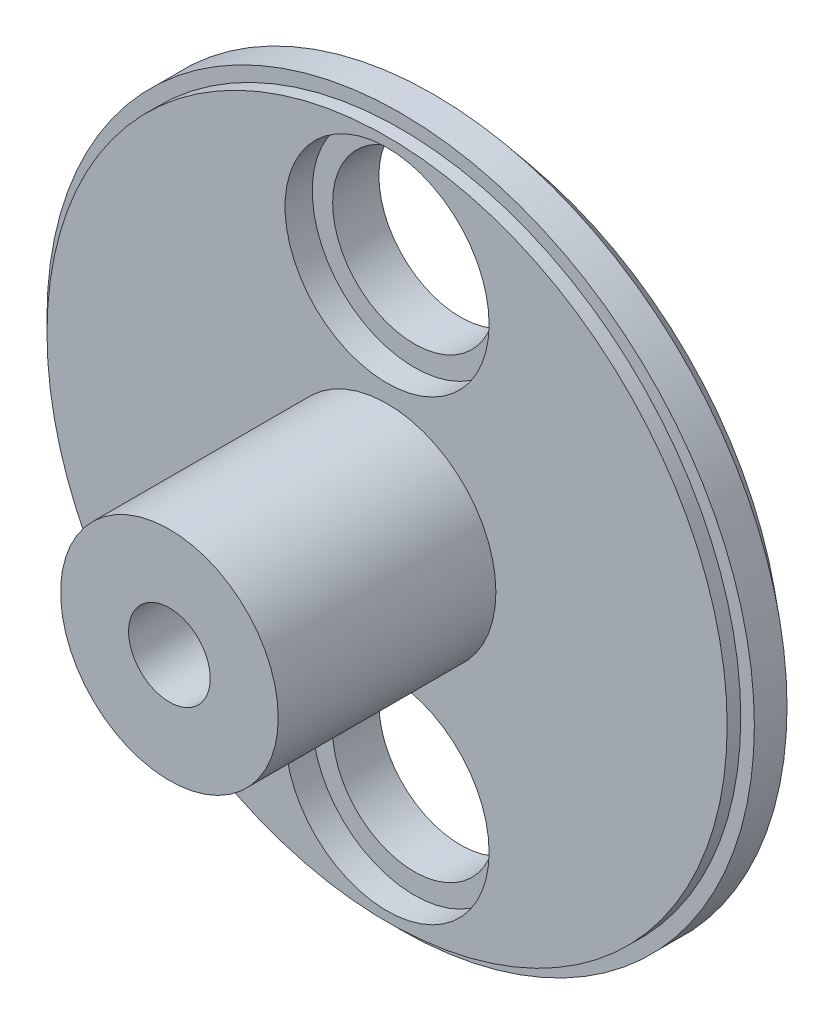
ISO-10303-21;
HEADER;
FILE_DESCRIPTION(('STEP AP214'),'2;1');
FILE_NAME('part.step','',(''),(''),'','','');
FILE_SCHEMA(('AUTOMOTIVE_DESIGN { 1 0 10303 214 1 1 1 1 }'));
ENDSEC;
DATA;
#1=APPLICATION_CONTEXT('core data for automotive mechanical design processes');
#2=APPLICATION_PROTOCOL_DEFINITION('international standard','automotive_design',2000,#1);
#3=PRODUCT_CONTEXT('',#1,'mechanical');
#4=PRODUCT('Part','Part','',(#3));
#5=PRODUCT_RELATED_PRODUCT_CATEGORY('part','',(#4));
#6=PRODUCT_DEFINITION_FORMATION('','',#4);
#7=PRODUCT_DEFINITION_CONTEXT('part definition',#1,'design');
#8=PRODUCT_DEFINITION('design','',#6,#7);
#9=PRODUCT_DEFINITION_SHAPE('','',#8);
#10=(LENGTH_UNIT() NAMED_UNIT(*) SI_UNIT(.MILLI.,.METRE.));
#11=(NAMED_UNIT(*) PLANE_ANGLE_UNIT() SI_UNIT($,.RADIAN.));
#12=(NAMED_UNIT(*) SI_UNIT($,.STERADIAN.) SOLID_ANGLE_UNIT());
#13=UNCERTAINTY_MEASURE_WITH_UNIT(LENGTH_MEASURE(1.E-05),#10,'distance_accuracy_value','');
#14=(GEOMETRIC_REPRESENTATION_CONTEXT(3) GLOBAL_UNCERTAINTY_ASSIGNED_CONTEXT((#13)) GLOBAL_UNIT_ASSIGNED_CONTEXT((#10,
#11,#12)) REPRESENTATION_CONTEXT('',''));
#15=CARTESIAN_POINT('',(0.,0.,0.));
#16=DIRECTION('',(0.,0.,1.));
#17=DIRECTION('',(1.,0.,0.));
#18=AXIS2_PLACEMENT_3D('',#15,#16,#17);
#19=CARTESIAN_POINT('',(0.,0.,2.7));
#20=DIRECTION('',(0.,0.,-1.));
#21=DIRECTION('',(-1.,0.,0.));
#22=AXIS2_PLACEMENT_3D('',#19,#20,#21);
#23=CYLINDRICAL_SURFACE('',#22,13.);
#24=CARTESIAN_POINT('',(0.,0.,0.999999999999999));
#25=DIRECTION('',(0.,0.,1.));
#26=DIRECTION('',(1.,0.,0.));
#27=AXIS2_PLACEMENT_3D('',#24,#25,#26);
#28=CIRCLE('',#27,13.);
#29=CARTESIAN_POINT('',(-13.,0.,0.999999999999999));
#30=VERTEX_POINT('',#29);
#31=EDGE_CURVE('E54',#30,#30,#28,.T.);
#32=CARTESIAN_POINT('',(0.,0.,2.2));
#33=DIRECTION('',(0.,0.,1.));
#34=DIRECTION('',(1.,0.,0.));
#35=AXIS2_PLACEMENT_3D('',#32,#33,#34);
#36=CIRCLE('',#35,13.);
#37=CARTESIAN_POINT('',(-13.,0.,2.2));
#38=VERTEX_POINT('',#37);
#39=EDGE_CURVE('E50',#38,#38,#36,.T.);
#40=CARTESIAN_POINT('',(-13.,0.,0.999999999999999));
#41=CARTESIAN_POINT('',(-13.,0.,1.0125));
#42=CARTESIAN_POINT('',(-13.,0.,1.025));
#43=CARTESIAN_POINT('',(-13.,0.,1.05));
#44=CARTESIAN_POINT('',(-13.,0.,1.0625));
#45=CARTESIAN_POINT('',(-13.,0.,1.0875));
#46=CARTESIAN_POINT('',(-13.,0.,1.1));
#47=CARTESIAN_POINT('',(-13.,0.,1.125));
#48=CARTESIAN_POINT('',(-13.,0.,1.1375));
#49=CARTESIAN_POINT('',(-13.,0.,1.1625));
#50=CARTESIAN_POINT('',(-13.,0.,1.175));
#51=CARTESIAN_POINT('',(-13.,0.,1.2));
#52=CARTESIAN_POINT('',(-13.,0.,1.2125));
#53=CARTESIAN_POINT('',(-13.,0.,1.2375));
#54=CARTESIAN_POINT('',(-13.,0.,1.25));
#55=CARTESIAN_POINT('',(-13.,0.,1.275));
#56=CARTESIAN_POINT('',(-13.,0.,1.2875));
#57=CARTESIAN_POINT('',(-13.,0.,1.3125));
#58=CARTESIAN_POINT('',(-13.,0.,1.325));
#59=CARTESIAN_POINT('',(-13.,0.,1.35));
#60=CARTESIAN_POINT('',(-13.,0.,1.3625));
#61=CARTESIAN_POINT('',(-13.,0.,1.3875));
#62=CARTESIAN_POINT('',(-13.,0.,1.4));
#63=CARTESIAN_POINT('',(-13.,0.,1.425));
#64=CARTESIAN_POINT('',(-13.,0.,1.4375));
#65=CARTESIAN_POINT('',(-13.,0.,1.4625));
#66=CARTESIAN_POINT('',(-13.,0.,1.475));
#67=CARTESIAN_POINT('',(-13.,0.,1.5));
#68=CARTESIAN_POINT('',(-13.,0.,1.5125));
#69=CARTESIAN_POINT('',(-13.,0.,1.5375));
#70=CARTESIAN_POINT('',(-13.,0.,1.55));
#71=CARTESIAN_POINT('',(-13.,0.,1.575));
#72=CARTESIAN_POINT('',(-13.,0.,1.5875));
#73=CARTESIAN_POINT('',(-13.,0.,1.6125));
#74=CARTESIAN_POINT('',(-13.,0.,1.625));
#75=CARTESIAN_POINT('',(-13.,0.,1.65));
#76=CARTESIAN_POINT('',(-13.,0.,1.6625));
#77=CARTESIAN_POINT('',(-13.,0.,1.6875));
#78=CARTESIAN_POINT('',(-13.,0.,1.7));
#79=CARTESIAN_POINT('',(-13.,0.,1.725));
#80=CARTESIAN_POINT('',(-13.,0.,1.7375));
#81=CARTESIAN_POINT('',(-13.,0.,1.7625));
#82=CARTESIAN_POINT('',(-13.,0.,1.775));
#83=CARTESIAN_POINT('',(-13.,0.,1.8));
#84=CARTESIAN_POINT('',(-13.,0.,1.8125));
#85=CARTESIAN_POINT('',(-13.,0.,1.8375));
#86=CARTESIAN_POINT('',(-13.,0.,1.85));
#87=CARTESIAN_POINT('',(-13.,0.,1.875));
#88=CARTESIAN_POINT('',(-13.,0.,1.8875));
#89=CARTESIAN_POINT('',(-13.,0.,1.9125));
#90=CARTESIAN_POINT('',(-13.,0.,1.925));
#91=CARTESIAN_POINT('',(-13.,0.,1.95));
#92=CARTESIAN_POINT('',(-13.,0.,1.9625));
#93=CARTESIAN_POINT('',(-13.,0.,1.9875));
#94=CARTESIAN_POINT('',(-13.,0.,2.));
#95=CARTESIAN_POINT('',(-13.,0.,2.025));
#96=CARTESIAN_POINT('',(-13.,0.,2.0375));
#97=CARTESIAN_POINT('',(-13.,0.,2.0625));
#98=CARTESIAN_POINT('',(-13.,0.,2.075));
#99=CARTESIAN_POINT('',(-13.,0.,2.1));
#100=CARTESIAN_POINT('',(-13.,0.,2.1125));
#101=CARTESIAN_POINT('',(-13.,0.,2.1375));
#102=CARTESIAN_POINT('',(-13.,0.,2.15));
#103=CARTESIAN_POINT('',(-13.,0.,2.175));
#104=CARTESIAN_POINT('',(-13.,0.,2.1875));
#105=CARTESIAN_POINT('',(-13.,0.,2.2));
#106=B_SPLINE_CURVE_WITH_KNOTS('',3,(#40,#41,#42,#43,#44,#45,#46,#47,#48,#49,#50,#51,#52,#53,
#54,#55,#56,#57,#58,#59,#60,#61,#62,#63,#64,#65,#66,#67,#68,#69,#70,#71,#72,#73,#74,#75,#76,#77,
#78,#79,#80,#81,#82,#83,#84,#85,#86,#87,#88,#89,#90,#91,#92,#93,#94,#95,#96,#97,#98,#99,#100,
#101,#102,#103,#104,#105),.UNSPECIFIED.,.F.,.F.,(4,2,2,2,2,2,2,2,2,2,2,2,2,2,2,2,2,2,2,2,2,2,2,
2,2,2,2,2,2,2,2,2,4),(0.,0.0375,0.075,0.1125,0.15,0.1875,0.225,0.2625,0.3,0.3375,0.375,
0.412500000000001,0.45,0.487500000000001,0.525,0.5625,0.600000000000001,0.637500000000001,
0.675000000000001,0.712500000000001,0.750000000000001,0.787500000000001,0.825000000000001,
0.862500000000001,0.900000000000001,0.937500000000001,0.975000000000001,1.0125,1.05,1.0875,
1.125,1.1625,1.2),.UNSPECIFIED.);
#107=EDGE_CURVE('BSEAM45',#30,#38,#106,.T.);
#108=ORIENTED_EDGE('',*,*,#31,.T.);
#109=ORIENTED_EDGE('',*,*,#39,.F.);
#110=ORIENTED_EDGE('',*,*,#107,.T.);
#111=ORIENTED_EDGE('',*,*,#107,.F.);
#112=EDGE_LOOP('',(#108,#110,#109,#111));
#113=FACE_BOUND('',#112,.T.);
#114=ADVANCED_FACE('F45',(#113),#23,.T.);
#115=CARTESIAN_POINT('',(0.,0.,2.7));
#116=DIRECTION('',(0.,0.,1.));
#117=DIRECTION('',(1.,0.,0.));
#118=AXIS2_PLACEMENT_3D('',#115,#116,#117);
#119=PLANE('',#118);
#120=CARTESIAN_POINT('',(0.,0.,2.7));
#121=DIRECTION('',(0.,0.,1.));
#122=DIRECTION('',(1.,0.,0.));
#123=AXIS2_PLACEMENT_3D('',#120,#121,#122);
#124=CIRCLE('',#123,4.);
#125=CARTESIAN_POINT('',(4.,0.,2.7));
#126=VERTEX_POINT('',#125);
#127=EDGE_CURVE('E91',#126,#126,#124,.T.);
#128=ORIENTED_EDGE('',*,*,#127,.F.);
#129=EDGE_LOOP('',(#128));
#130=FACE_BOUND('',#129,.T.);
#131=CARTESIAN_POINT('',(0.,-8.4,2.7));
#132=DIRECTION('',(0.,0.,1.));
#133=DIRECTION('',(1.,0.,0.));
#134=AXIS2_PLACEMENT_3D('',#131,#132,#133);
#135=CIRCLE('',#134,3.75);
#136=CARTESIAN_POINT('',(3.75,-8.4,2.7));
#137=VERTEX_POINT('',#136);
#138=EDGE_CURVE('E67',#137,#137,#135,.T.);
#139=ORIENTED_EDGE('',*,*,#138,.F.);
#140=EDGE_LOOP('',(#139));
#141=FACE_BOUND('',#140,.T.);
#142=CARTESIAN_POINT('',(0.,8.4,2.7));
#143=DIRECTION('',(0.,0.,1.));
#144=DIRECTION('',(1.,0.,0.));
#145=AXIS2_PLACEMENT_3D('',#142,#143,#144);
#146=CIRCLE('',#145,3.75);
#147=CARTESIAN_POINT('',(3.75,8.4,2.7));
#148=VERTEX_POINT('',#147);
#149=EDGE_CURVE('E74',#148,#148,#146,.T.);
#150=ORIENTED_EDGE('',*,*,#149,.F.);
#151=EDGE_LOOP('',(#150));
#152=FACE_BOUND('',#151,.T.);
#153=CARTESIAN_POINT('',(0.,0.,2.7));
#154=DIRECTION('',(0.,0.,1.));
#155=DIRECTION('',(1.,0.,0.));
#156=AXIS2_PLACEMENT_3D('',#153,#154,#155);
#157=CIRCLE('',#156,12.5);
#158=CARTESIAN_POINT('',(12.5,0.,2.7));
#159=VERTEX_POINT('',#158);
#160=EDGE_CURVE('E84',#159,#159,#157,.T.);
#161=ORIENTED_EDGE('',*,*,#160,.T.);
#162=EDGE_LOOP('',(#161));
#163=FACE_BOUND('',#162,.T.);
#164=ADVANCED_FACE('F124',(#130,#141,#152,#163),#119,.T.);
#165=CARTESIAN_POINT('',(0.,8.4,2.7));
#166=DIRECTION('',(0.,0.,-1.));
#167=DIRECTION('',(-1.,0.,0.));
#168=AXIS2_PLACEMENT_3D('',#165,#166,#167);
#169=CYLINDRICAL_SURFACE('',#168,3.);
#170=CARTESIAN_POINT('',(0.,8.4,0.));
#171=DIRECTION('',(0.,0.,1.));
#172=DIRECTION('',(1.,0.,0.));
#173=AXIS2_PLACEMENT_3D('',#170,#171,#172);
#174=CIRCLE('',#173,3.);
#175=CARTESIAN_POINT('',(-3.,8.4,0.));
#176=VERTEX_POINT('',#175);
#177=EDGE_CURVE('E58',#176,#176,#174,.T.);
#178=CARTESIAN_POINT('',(0.,8.4,1.7));
#179=DIRECTION('',(0.,0.,1.));
#180=DIRECTION('',(1.,0.,0.));
#181=AXIS2_PLACEMENT_3D('',#178,#179,#180);
#182=CIRCLE('',#181,3.);
#183=CARTESIAN_POINT('',(-3.,8.4,1.7));
#184=VERTEX_POINT('',#183);
#185=EDGE_CURVE('E79',#184,#184,#182,.F.);
#186=CARTESIAN_POINT('',(-3.,8.4,0.));
#187=CARTESIAN_POINT('',(-3.,8.4,0.017708333333333));
#188=CARTESIAN_POINT('',(-3.,8.4,0.0354166666666664));
#189=CARTESIAN_POINT('',(-3.,8.4,0.070833333333333));
#190=CARTESIAN_POINT('',(-3.,8.4,0.0885416666666663));
#191=CARTESIAN_POINT('',(-3.,8.4,0.123958333333333));
#192=CARTESIAN_POINT('',(-3.,8.4,0.141666666666666));
#193=CARTESIAN_POINT('',(-3.,8.4,0.177083333333333));
#194=CARTESIAN_POINT('',(-3.,8.4,0.194791666666666));
#195=CARTESIAN_POINT('',(-3.,8.4,0.230208333333333));
#196=CARTESIAN_POINT('',(-3.,8.4,0.247916666666666));
#197=CARTESIAN_POINT('',(-3.,8.4,0.283333333333333));
#198=CARTESIAN_POINT('',(-3.,8.4,0.301041666666666));
#199=CARTESIAN_POINT('',(-3.,8.4,0.336458333333333));
#200=CARTESIAN_POINT('',(-3.,8.4,0.354166666666666));
#201=CARTESIAN_POINT('',(-3.,8.4,0.389583333333333));
#202=CARTESIAN_POINT('',(-3.,8.4,0.407291666666666));
#203=CARTESIAN_POINT('',(-3.,8.4,0.442708333333333));
#204=CARTESIAN_POINT('',(-3.,8.4,0.460416666666666));
#205=CARTESIAN_POINT('',(-3.,8.4,0.495833333333333));
#206=CARTESIAN_POINT('',(-3.,8.4,0.513541666666666));
#207=CARTESIAN_POINT('',(-3.,8.4,0.548958333333333));
#208=CARTESIAN_POINT('',(-3.,8.4,0.566666666666666));
#209=CARTESIAN_POINT('',(-3.,8.4,0.602083333333333));
#210=CARTESIAN_POINT('',(-3.,8.4,0.619791666666666));
#211=CARTESIAN_POINT('',(-3.,8.4,0.655208333333333));
#212=CARTESIAN_POINT('',(-3.,8.4,0.672916666666666));
#213=CARTESIAN_POINT('',(-3.,8.4,0.708333333333333));
#214=CARTESIAN_POINT('',(-3.,8.4,0.726041666666667));
#215=CARTESIAN_POINT('',(-3.,8.4,0.761458333333333));
#216=CARTESIAN_POINT('',(-3.,8.4,0.779166666666666));
#217=CARTESIAN_POINT('',(-3.,8.4,0.814583333333333));
#218=CARTESIAN_POINT('',(-3.,8.4,0.832291666666666));
#219=CARTESIAN_POINT('',(-3.,8.4,0.867708333333333));
#220=CARTESIAN_POINT('',(-3.,8.4,0.885416666666666));
#221=CARTESIAN_POINT('',(-3.,8.4,0.920833333333333));
#222=CARTESIAN_POINT('',(-3.,8.4,0.938541666666666));
#223=CARTESIAN_POINT('',(-3.,8.4,0.973958333333333));
#224=CARTESIAN_POINT('',(-3.,8.4,0.991666666666666));
#225=CARTESIAN_POINT('',(-3.,8.4,1.02708333333333));
#226=CARTESIAN_POINT('',(-3.,8.4,1.04479166666667));
#227=CARTESIAN_POINT('',(-3.,8.4,1.08020833333333));
#228=CARTESIAN_POINT('',(-3.,8.4,1.09791666666667));
#229=CARTESIAN_POINT('',(-3.,8.4,1.13333333333333));
#230=CARTESIAN_POINT('',(-3.,8.4,1.15104166666667));
#231=CARTESIAN_POINT('',(-3.,8.4,1.18645833333333));
#232=CARTESIAN_POINT('',(-3.,8.4,1.20416666666667));
#233=CARTESIAN_POINT('',(-3.,8.4,1.23958333333333));
#234=CARTESIAN_POINT('',(-3.,8.4,1.25729166666667));
#235=CARTESIAN_POINT('',(-3.,8.4,1.29270833333333));
#236=CARTESIAN_POINT('',(-3.,8.4,1.31041666666667));
#237=CARTESIAN_POINT('',(-3.,8.4,1.34583333333333));
#238=CARTESIAN_POINT('',(-3.,8.4,1.36354166666667));
#239=CARTESIAN_POINT('',(-3.,8.4,1.39895833333333));
#240=CARTESIAN_POINT('',(-3.,8.4,1.41666666666667));
#241=CARTESIAN_POINT('',(-3.,8.4,1.45208333333333));
#242=CARTESIAN_POINT('',(-3.,8.4,1.46979166666667));
#243=CARTESIAN_POINT('',(-3.,8.4,1.50520833333333));
#244=CARTESIAN_POINT('',(-3.,8.4,1.52291666666667));
#245=CARTESIAN_POINT('',(-3.,8.4,1.55833333333333));
#246=CARTESIAN_POINT('',(-3.,8.4,1.57604166666667));
#247=CARTESIAN_POINT('',(-3.,8.4,1.61145833333333));
#248=CARTESIAN_POINT('',(-3.,8.4,1.62916666666667));
#249=CARTESIAN_POINT('',(-3.,8.4,1.66458333333333));
#250=CARTESIAN_POINT('',(-3.,8.4,1.68229166666667));
#251=CARTESIAN_POINT('',(-3.,8.4,1.7));
#252=B_SPLINE_CURVE_WITH_KNOTS('',3,(#186,#187,#188,#189,#190,#191,#192,#193,#194,#195,#196,
#197,#198,#199,#200,#201,#202,#203,#204,#205,#206,#207,#208,#209,#210,#211,#212,#213,#214,#215,
#216,#217,#218,#219,#220,#221,#222,#223,#224,#225,#226,#227,#228,#229,#230,#231,#232,#233,#234,
#235,#236,#237,#238,#239,#240,#241,#242,#243,#244,#245,#246,#247,#248,#249,#250,#251),
.UNSPECIFIED.,.F.,.F.,(4,2,2,2,2,2,2,2,2,2,2,2,2,2,2,2,2,2,2,2,2,2,2,2,2,2,2,2,2,2,2,2,4),(0.,
0.0531250000000002,0.10625,0.159375,0.2125,0.265625,0.31875,0.371875,0.425,0.478125,0.53125,
0.584375,0.6375,0.690625,0.74375,0.796875,0.85,0.903125,0.95625,1.009375,1.0625,1.115625,
1.16875,1.221875,1.275,1.328125,1.38125,1.434375,1.4875,1.540625,1.59375,1.646875,1.7),.UNSPECIFIED.);
#253=EDGE_CURVE('BSEAM127',#176,#184,#252,.T.);
#254=ORIENTED_EDGE('',*,*,#177,.F.);
#255=ORIENTED_EDGE('',*,*,#185,.F.);
#256=ORIENTED_EDGE('',*,*,#253,.T.);
#257=ORIENTED_EDGE('',*,*,#253,.F.);
#258=EDGE_LOOP('',(#254,#256,#255,#257));
#259=FACE_BOUND('',#258,.T.);
#260=ADVANCED_FACE('F127',(#259),#169,.F.);
#261=CARTESIAN_POINT('',(0.,-8.4,2.7));
#262=DIRECTION('',(0.,0.,-1.));
#263=DIRECTION('',(-1.,0.,0.));
#264=AXIS2_PLACEMENT_3D('',#261,#262,#263);
#265=CYLINDRICAL_SURFACE('',#264,3.);
#266=CARTESIAN_POINT('',(0.,-8.4,0.));
#267=DIRECTION('',(0.,0.,1.));
#268=DIRECTION('',(1.,0.,0.));
#269=AXIS2_PLACEMENT_3D('',#266,#267,#268);
#270=CIRCLE('',#269,3.);
#271=CARTESIAN_POINT('',(-3.,-8.4,0.));
#272=VERTEX_POINT('',#271);
#273=EDGE_CURVE('E63',#272,#272,#270,.T.);
#274=CARTESIAN_POINT('',(0.,-8.4,1.7));
#275=DIRECTION('',(0.,0.,1.));
#276=DIRECTION('',(1.,0.,0.));
#277=AXIS2_PLACEMENT_3D('',#274,#275,#276);
#278=CIRCLE('',#277,3.);
#279=CARTESIAN_POINT('',(-3.,-8.4,1.7));
#280=VERTEX_POINT('',#279);
#281=EDGE_CURVE('E70',#280,#280,#278,.F.);
#282=CARTESIAN_POINT('',(-3.,-8.4,0.));
#283=CARTESIAN_POINT('',(-3.,-8.4,0.017708333333333));
#284=CARTESIAN_POINT('',(-3.,-8.4,0.0354166666666664));
#285=CARTESIAN_POINT('',(-3.,-8.4,0.070833333333333));
#286=CARTESIAN_POINT('',(-3.,-8.4,0.0885416666666663));
#287=CARTESIAN_POINT('',(-3.,-8.4,0.123958333333333));
#288=CARTESIAN_POINT('',(-3.,-8.4,0.141666666666666));
#289=CARTESIAN_POINT('',(-3.,-8.4,0.177083333333333));
#290=CARTESIAN_POINT('',(-3.,-8.4,0.194791666666666));
#291=CARTESIAN_POINT('',(-3.,-8.4,0.230208333333333));
#292=CARTESIAN_POINT('',(-3.,-8.4,0.247916666666666));
#293=CARTESIAN_POINT('',(-3.,-8.4,0.283333333333333));
#294=CARTESIAN_POINT('',(-3.,-8.4,0.301041666666666));
#295=CARTESIAN_POINT('',(-3.,-8.4,0.336458333333333));
#296=CARTESIAN_POINT('',(-3.,-8.4,0.354166666666666));
#297=CARTESIAN_POINT('',(-3.,-8.4,0.389583333333333));
#298=CARTESIAN_POINT('',(-3.,-8.4,0.407291666666666));
#299=CARTESIAN_POINT('',(-3.,-8.4,0.442708333333333));
#300=CARTESIAN_POINT('',(-3.,-8.4,0.460416666666666));
#301=CARTESIAN_POINT('',(-3.,-8.4,0.495833333333333));
#302=CARTESIAN_POINT('',(-3.,-8.4,0.513541666666666));
#303=CARTESIAN_POINT('',(-3.,-8.4,0.548958333333333));
#304=CARTESIAN_POINT('',(-3.,-8.4,0.566666666666666));
#305=CARTESIAN_POINT('',(-3.,-8.4,0.602083333333333));
#306=CARTESIAN_POINT('',(-3.,-8.4,0.619791666666666));
#307=CARTESIAN_POINT('',(-3.,-8.4,0.655208333333333));
#308=CARTESIAN_POINT('',(-3.,-8.4,0.672916666666666));
#309=CARTESIAN_POINT('',(-3.,-8.4,0.708333333333333));
#310=CARTESIAN_POINT('',(-3.,-8.4,0.726041666666667));
#311=CARTESIAN_POINT('',(-3.,-8.4,0.761458333333333));
#312=CARTESIAN_POINT('',(-3.,-8.4,0.779166666666666));
#313=CARTESIAN_POINT('',(-3.,-8.4,0.814583333333333));
#314=CARTESIAN_POINT('',(-3.,-8.4,0.832291666666666));
#315=CARTESIAN_POINT('',(-3.,-8.4,0.867708333333333));
#316=CARTESIAN_POINT('',(-3.,-8.4,0.885416666666666));
#317=CARTESIAN_POINT('',(-3.,-8.4,0.920833333333333));
#318=CARTESIAN_POINT('',(-3.,-8.4,0.938541666666666));
#319=CARTESIAN_POINT('',(-3.,-8.4,0.973958333333333));
#320=CARTESIAN_POINT('',(-3.,-8.4,0.991666666666666));
#321=CARTESIAN_POINT('',(-3.,-8.4,1.02708333333333));
#322=CARTESIAN_POINT('',(-3.,-8.4,1.04479166666667));
#323=CARTESIAN_POINT('',(-3.,-8.4,1.08020833333333));
#324=CARTESIAN_POINT('',(-3.,-8.4,1.09791666666667));
#325=CARTESIAN_POINT('',(-3.,-8.4,1.13333333333333));
#326=CARTESIAN_POINT('',(-3.,-8.4,1.15104166666667));
#327=CARTESIAN_POINT('',(-3.,-8.4,1.18645833333333));
#328=CARTESIAN_POINT('',(-3.,-8.4,1.20416666666667));
#329=CARTESIAN_POINT('',(-3.,-8.4,1.23958333333333));
#330=CARTESIAN_POINT('',(-3.,-8.4,1.25729166666667));
#331=CARTESIAN_POINT('',(-3.,-8.4,1.29270833333333));
#332=CARTESIAN_POINT('',(-3.,-8.4,1.31041666666667));
#333=CARTESIAN_POINT('',(-3.,-8.4,1.34583333333333));
#334=CARTESIAN_POINT('',(-3.,-8.4,1.36354166666667));
#335=CARTESIAN_POINT('',(-3.,-8.4,1.39895833333333));
#336=CARTESIAN_POINT('',(-3.,-8.4,1.41666666666667));
#337=CARTESIAN_POINT('',(-3.,-8.4,1.45208333333333));
#338=CARTESIAN_POINT('',(-3.,-8.4,1.46979166666667));
#339=CARTESIAN_POINT('',(-3.,-8.4,1.50520833333333));
#340=CARTESIAN_POINT('',(-3.,-8.4,1.52291666666667));
#341=CARTESIAN_POINT('',(-3.,-8.4,1.55833333333333));
#342=CARTESIAN_POINT('',(-3.,-8.4,1.57604166666667));
#343=CARTESIAN_POINT('',(-3.,-8.4,1.61145833333333));
#344=CARTESIAN_POINT('',(-3.,-8.4,1.62916666666667));
#345=CARTESIAN_POINT('',(-3.,-8.4,1.66458333333333));
#346=CARTESIAN_POINT('',(-3.,-8.4,1.68229166666667));
#347=CARTESIAN_POINT('',(-3.,-8.4,1.7));
#348=B_SPLINE_CURVE_WITH_KNOTS('',3,(#282,#283,#284,#285,#286,#287,#288,#289,#290,#291,#292,
#293,#294,#295,#296,#297,#298,#299,#300,#301,#302,#303,#304,#305,#306,#307,#308,#309,#310,#311,
#312,#313,#314,#315,#316,#317,#318,#319,#320,#321,#322,#323,#324,#325,#326,#327,#328,#329,#330,
#331,#332,#333,#334,#335,#336,#337,#338,#339,#340,#341,#342,#343,#344,#345,#346,#347),
.UNSPECIFIED.,.F.,.F.,(4,2,2,2,2,2,2,2,2,2,2,2,2,2,2,2,2,2,2,2,2,2,2,2,2,2,2,2,2,2,2,2,4),(0.,
0.0531250000000002,0.10625,0.159375,0.2125,0.265625,0.31875,0.371875,0.425,0.478125,0.53125,
0.584375,0.6375,0.690625,0.74375,0.796875,0.85,0.903125,0.95625,1.009375,1.0625,1.115625,
1.16875,1.221875,1.275,1.328125,1.38125,1.434375,1.4875,1.540625,1.59375,1.646875,1.7),.UNSPECIFIED.);
#349=EDGE_CURVE('BSEAM155',#272,#280,#348,.T.);
#350=ORIENTED_EDGE('',*,*,#273,.F.);
#351=ORIENTED_EDGE('',*,*,#281,.F.);
#352=ORIENTED_EDGE('',*,*,#349,.T.);
#353=ORIENTED_EDGE('',*,*,#349,.F.);
#354=EDGE_LOOP('',(#350,#352,#351,#353));
#355=FACE_BOUND('',#354,.T.);
#356=ADVANCED_FACE('F155',(#355),#265,.F.);
#357=CARTESIAN_POINT('',(0.,0.,0.));
#358=DIRECTION('',(0.,0.,1.));
#359=DIRECTION('',(1.,0.,0.));
#360=AXIS2_PLACEMENT_3D('',#357,#358,#359);
#361=PLANE('',#360);
#362=CARTESIAN_POINT('',(0.,0.,0.));
#363=DIRECTION('',(0.,0.,1.));
#364=DIRECTION('',(1.,0.,0.));
#365=AXIS2_PLACEMENT_3D('',#362,#363,#364);
#366=CIRCLE('',#365,11.8082464074058);
#367=CARTESIAN_POINT('',(11.8082464074058,0.,0.));
#368=VERTEX_POINT('',#367);
#369=EDGE_CURVE('E10',#368,#368,#366,.F.);
#370=ORIENTED_EDGE('',*,*,#369,.T.);
#371=EDGE_LOOP('',(#370));
#372=FACE_BOUND('',#371,.T.);
#373=ORIENTED_EDGE('',*,*,#273,.T.);
#374=EDGE_LOOP('',(#373));
#375=FACE_BOUND('',#374,.T.);
#376=ORIENTED_EDGE('',*,*,#177,.T.);
#377=EDGE_LOOP('',(#376));
#378=FACE_BOUND('',#377,.T.);
#379=ADVANCED_FACE('F153',(#372,#375,#378),#361,.F.);
#380=CARTESIAN_POINT('',(0.,0.,0.999999999999999));
#381=DIRECTION('',(0.,0.,1.));
#382=DIRECTION('',(1.,0.,0.));
#383=AXIS2_PLACEMENT_3D('',#380,#381,#382);
#384=CONICAL_SURFACE('',#383,13.,0.872664625997162);
#385=ORIENTED_EDGE('',*,*,#369,.F.);
#386=EDGE_LOOP('',(#385));
#387=FACE_BOUND('',#386,.T.);
#388=ORIENTED_EDGE('',*,*,#31,.F.);
#389=EDGE_LOOP('',(#388));
#390=FACE_BOUND('',#389,.T.);
#391=ADVANCED_FACE('F48',(#387,#390),#384,.T.);
#392=CARTESIAN_POINT('',(0.,-8.4,1.7));
#393=DIRECTION('',(0.,0.,1.));
#394=DIRECTION('',(1.,0.,0.));
#395=AXIS2_PLACEMENT_3D('',#392,#393,#394);
#396=CYLINDRICAL_SURFACE('',#395,3.75);
#397=CARTESIAN_POINT('',(0.,-8.4,1.7));
#398=DIRECTION('',(0.,0.,1.));
#399=DIRECTION('',(1.,0.,0.));
#400=AXIS2_PLACEMENT_3D('',#397,#398,#399);
#401=CIRCLE('',#400,3.75);
#402=CARTESIAN_POINT('',(3.75,-8.4,1.7));
#403=VERTEX_POINT('',#402);
#404=EDGE_CURVE('E71',#403,#403,#401,.T.);
#405=ORIENTED_EDGE('',*,*,#404,.F.);
#406=EDGE_LOOP('',(#405));
#407=FACE_BOUND('',#406,.T.);
#408=ORIENTED_EDGE('',*,*,#138,.T.);
#409=EDGE_LOOP('',(#408));
#410=FACE_BOUND('',#409,.T.);
#411=ADVANCED_FACE('F170',(#407,#410),#396,.F.);
#412=CARTESIAN_POINT('',(0.,0.,1.7));
#413=DIRECTION('',(0.,0.,1.));
#414=DIRECTION('',(1.,0.,0.));
#415=AXIS2_PLACEMENT_3D('',#412,#413,#414);
#416=PLANE('',#415);
#417=ORIENTED_EDGE('',*,*,#281,.T.);
#418=EDGE_LOOP('',(#417));
#419=FACE_BOUND('',#418,.T.);
#420=ORIENTED_EDGE('',*,*,#404,.T.);
#421=EDGE_LOOP('',(#420));
#422=FACE_BOUND('',#421,.T.);
#423=ADVANCED_FACE('F166',(#419,#422),#416,.T.);
#424=CARTESIAN_POINT('',(0.,8.4,1.7));
#425=DIRECTION('',(0.,0.,1.));
#426=DIRECTION('',(1.,0.,0.));
#427=AXIS2_PLACEMENT_3D('',#424,#425,#426);
#428=CYLINDRICAL_SURFACE('',#427,3.75);
#429=CARTESIAN_POINT('',(0.,8.4,1.7));
#430=DIRECTION('',(0.,0.,1.));
#431=DIRECTION('',(1.,0.,0.));
#432=AXIS2_PLACEMENT_3D('',#429,#430,#431);
#433=CIRCLE('',#432,3.75);
#434=CARTESIAN_POINT('',(3.75,8.4,1.7));
#435=VERTEX_POINT('',#434);
#436=EDGE_CURVE('E66',#435,#435,#433,.T.);
#437=ORIENTED_EDGE('',*,*,#436,.F.);
#438=EDGE_LOOP('',(#437));
#439=FACE_BOUND('',#438,.T.);
#440=ORIENTED_EDGE('',*,*,#149,.T.);
#441=EDGE_LOOP('',(#440));
#442=FACE_BOUND('',#441,.T.);
#443=ADVANCED_FACE('F169',(#439,#442),#428,.F.);
#444=CARTESIAN_POINT('',(0.,0.,1.7));
#445=DIRECTION('',(0.,0.,1.));
#446=DIRECTION('',(1.,0.,0.));
#447=AXIS2_PLACEMENT_3D('',#444,#445,#446);
#448=PLANE('',#447);
#449=ORIENTED_EDGE('',*,*,#185,.T.);
#450=EDGE_LOOP('',(#449));
#451=FACE_BOUND('',#450,.T.);
#452=ORIENTED_EDGE('',*,*,#436,.T.);
#453=EDGE_LOOP('',(#452));
#454=FACE_BOUND('',#453,.T.);
#455=ADVANCED_FACE('F142',(#451,#454),#448,.T.);
#456=CARTESIAN_POINT('',(0.,0.,2.2));
#457=DIRECTION('',(0.,0.,1.));
#458=DIRECTION('',(1.,0.,0.));
#459=AXIS2_PLACEMENT_3D('',#456,#457,#458);
#460=PLANE('',#459);
#461=CARTESIAN_POINT('',(0.,0.,2.2));
#462=DIRECTION('',(0.,0.,1.));
#463=DIRECTION('',(1.,0.,0.));
#464=AXIS2_PLACEMENT_3D('',#461,#462,#463);
#465=CIRCLE('',#464,12.5);
#466=CARTESIAN_POINT('',(12.5,0.,2.2));
#467=VERTEX_POINT('',#466);
#468=EDGE_CURVE('E87',#467,#467,#465,.T.);
#469=ORIENTED_EDGE('',*,*,#468,.F.);
#470=EDGE_LOOP('',(#469));
#471=FACE_BOUND('',#470,.T.);
#472=ORIENTED_EDGE('',*,*,#39,.T.);
#473=EDGE_LOOP('',(#472));
#474=FACE_BOUND('',#473,.T.);
#475=ADVANCED_FACE('F136',(#471,#474),#460,.T.);
#476=CARTESIAN_POINT('',(0.,0.,2.2));
#477=DIRECTION('',(0.,0.,1.));
#478=DIRECTION('',(1.,0.,0.));
#479=AXIS2_PLACEMENT_3D('',#476,#477,#478);
#480=CYLINDRICAL_SURFACE('',#479,12.5);
#481=ORIENTED_EDGE('',*,*,#468,.T.);
#482=EDGE_LOOP('',(#481));
#483=FACE_BOUND('',#482,.T.);
#484=ORIENTED_EDGE('',*,*,#160,.F.);
#485=EDGE_LOOP('',(#484));
#486=FACE_BOUND('',#485,.T.);
#487=ADVANCED_FACE('F120',(#483,#486),#480,.T.);
#488=CARTESIAN_POINT('',(0.,0.,10.7));
#489=DIRECTION('',(0.,0.,-1.));
#490=DIRECTION('',(-1.,0.,0.));
#491=AXIS2_PLACEMENT_3D('',#488,#489,#490);
#492=CYLINDRICAL_SURFACE('',#491,4.);
#493=CARTESIAN_POINT('',(0.,0.,10.7));
#494=DIRECTION('',(0.,0.,1.));
#495=DIRECTION('',(1.,0.,0.));
#496=AXIS2_PLACEMENT_3D('',#493,#494,#495);
#497=CIRCLE('',#496,4.);
#498=CARTESIAN_POINT('',(4.,0.,10.7));
#499=VERTEX_POINT('',#498);
#500=EDGE_CURVE('E88',#499,#499,#497,.T.);
#501=ORIENTED_EDGE('',*,*,#500,.F.);
#502=EDGE_LOOP('',(#501));
#503=FACE_BOUND('',#502,.T.);
#504=ORIENTED_EDGE('',*,*,#127,.T.);
#505=EDGE_LOOP('',(#504));
#506=FACE_BOUND('',#505,.T.);
#507=ADVANCED_FACE('F114',(#503,#506),#492,.T.);
#508=CARTESIAN_POINT('',(0.,0.,10.7));
#509=DIRECTION('',(0.,0.,1.));
#510=DIRECTION('',(1.,0.,0.));
#511=AXIS2_PLACEMENT_3D('',#508,#509,#510);
#512=PLANE('',#511);
#513=CARTESIAN_POINT('',(0.,0.,10.7));
#514=DIRECTION('',(0.,0.,1.));
#515=DIRECTION('',(1.,0.,0.));
#516=AXIS2_PLACEMENT_3D('',#513,#514,#515);
#517=CIRCLE('',#516,1.5);
#518=CARTESIAN_POINT('',(1.5,0.,10.7));
#519=VERTEX_POINT('',#518);
#520=EDGE_CURVE('E97',#519,#519,#517,.T.);
#521=ORIENTED_EDGE('',*,*,#520,.F.);
#522=EDGE_LOOP('',(#521));
#523=FACE_BOUND('',#522,.T.);
#524=ORIENTED_EDGE('',*,*,#500,.T.);
#525=EDGE_LOOP('',(#524));
#526=FACE_BOUND('',#525,.T.);
#527=ADVANCED_FACE('F108',(#523,#526),#512,.T.);
#528=CARTESIAN_POINT('',(0.,0.,7.7));
#529=DIRECTION('',(0.,0.,1.));
#530=DIRECTION('',(1.,0.,0.));
#531=AXIS2_PLACEMENT_3D('',#528,#529,#530);
#532=CYLINDRICAL_SURFACE('',#531,1.5);
#533=CARTESIAN_POINT('',(0.,0.,7.7));
#534=DIRECTION('',(0.,0.,1.));
#535=DIRECTION('',(1.,0.,0.));
#536=AXIS2_PLACEMENT_3D('',#533,#534,#535);
#537=CIRCLE('',#536,1.5);
#538=CARTESIAN_POINT('',(1.5,0.,7.7));
#539=VERTEX_POINT('',#538);
#540=EDGE_CURVE('E94',#539,#539,#537,.T.);
#541=ORIENTED_EDGE('',*,*,#540,.F.);
#542=EDGE_LOOP('',(#541));
#543=FACE_BOUND('',#542,.T.);
#544=ORIENTED_EDGE('',*,*,#520,.T.);
#545=EDGE_LOOP('',(#544));
#546=FACE_BOUND('',#545,.T.);
#547=ADVANCED_FACE('F105',(#543,#546),#532,.F.);
#548=CARTESIAN_POINT('',(0.,0.,7.7));
#549=DIRECTION('',(0.,0.,1.));
#550=DIRECTION('',(1.,0.,0.));
#551=AXIS2_PLACEMENT_3D('',#548,#549,#550);
#552=PLANE('',#551);
#553=ORIENTED_EDGE('',*,*,#540,.T.);
#554=EDGE_LOOP('',(#553));
#555=FACE_BOUND('',#554,.T.);
#556=ADVANCED_FACE('F103',(#555),#552,.T.);
#557=CLOSED_SHELL('',(#114,#164,#260,#356,#379,#391,#411,#423,#443,#455,#475,#487,#507,#527,
#547,#556));
#558=MANIFOLD_SOLID_BREP('B2',#557);
#559=ADVANCED_BREP_SHAPE_REPRESENTATION('',(#18,#558),#14);
#560=SHAPE_DEFINITION_REPRESENTATION(#9,#559);
ENDSEC;
END-ISO-10303-21;
